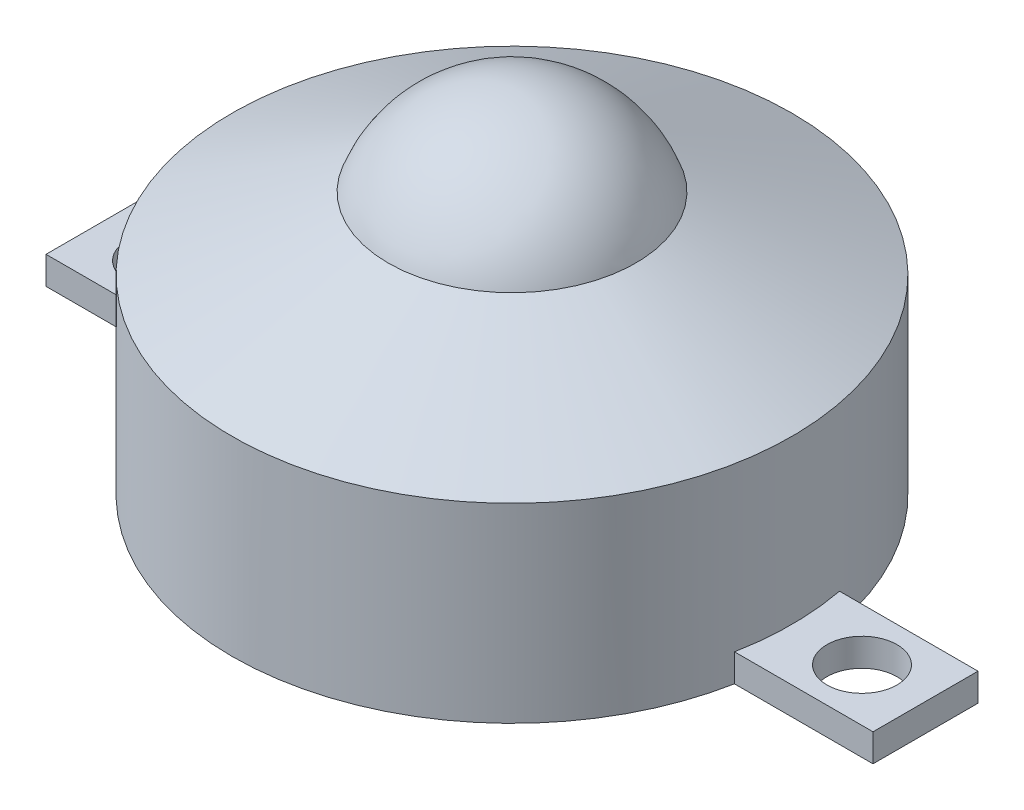
ISO-10303-21;
HEADER;
FILE_DESCRIPTION(('STEP AP214'),'2;1');
FILE_NAME('part.step','',(''),(''),'','','');
FILE_SCHEMA(('AUTOMOTIVE_DESIGN { 1 0 10303 214 1 1 1 1 }'));
ENDSEC;
DATA;
#1=APPLICATION_CONTEXT('core data for automotive mechanical design processes');
#2=APPLICATION_PROTOCOL_DEFINITION('international standard','automotive_design',2000,#1);
#3=PRODUCT_CONTEXT('',#1,'mechanical');
#4=PRODUCT('Part','Part','',(#3));
#5=PRODUCT_RELATED_PRODUCT_CATEGORY('part','',(#4));
#6=PRODUCT_DEFINITION_FORMATION('','',#4);
#7=PRODUCT_DEFINITION_CONTEXT('part definition',#1,'design');
#8=PRODUCT_DEFINITION('design','',#6,#7);
#9=PRODUCT_DEFINITION_SHAPE('','',#8);
#10=(LENGTH_UNIT() NAMED_UNIT(*) SI_UNIT(.MILLI.,.METRE.));
#11=(NAMED_UNIT(*) PLANE_ANGLE_UNIT() SI_UNIT($,.RADIAN.));
#12=(NAMED_UNIT(*) SI_UNIT($,.STERADIAN.) SOLID_ANGLE_UNIT());
#13=UNCERTAINTY_MEASURE_WITH_UNIT(LENGTH_MEASURE(1.E-05),#10,'distance_accuracy_value','');
#14=(GEOMETRIC_REPRESENTATION_CONTEXT(3) GLOBAL_UNCERTAINTY_ASSIGNED_CONTEXT((#13)) GLOBAL_UNIT_ASSIGNED_CONTEXT((#10,
#11,#12)) REPRESENTATION_CONTEXT('',''));
#15=CARTESIAN_POINT('',(0.,0.,0.));
#16=DIRECTION('',(0.,0.,1.));
#17=DIRECTION('',(1.,0.,0.));
#18=AXIS2_PLACEMENT_3D('',#15,#16,#17);
#19=CARTESIAN_POINT('',(0.,12.5014689607191,2.90235366842348E-05));
#20=DIRECTION('',(-1.,0.,0.));
#21=DIRECTION('',(0.,0.,-1.));
#22=AXIS2_PLACEMENT_3D('',#19,#20,#21);
#23=CIRCLE('',#22,7.49853103933704);
#24=TRIMMED_CURVE('',#23,(PARAMETER_VALUE(-1.57079245623191)),
(PARAMETER_VALUE(1.57079245623191)),.T.,.PARAMETER.);
#25=CARTESIAN_POINT('',(0.,12.5014689607191,0.));
#26=DIRECTION('',(0.,-1.,0.));
#27=AXIS1_PLACEMENT('',#25,#26);
#28=SURFACE_OF_REVOLUTION('',#24,#27);
#29=CARTESIAN_POINT('',(0.,15.,0.));
#30=DIRECTION('',(0.,-1.,0.));
#31=DIRECTION('',(0.,0.,-1.));
#32=AXIS2_PLACEMENT_3D('',#29,#30,#31);
#33=CIRCLE('',#32,7.07);
#34=CARTESIAN_POINT('',(0.,15.,-7.07));
#35=VERTEX_POINT('',#34);
#36=EDGE_CURVE('E157',#35,#35,#33,.T.);
#37=ORIENTED_EDGE('',*,*,#36,.F.);
#38=EDGE_LOOP('',(#37));
#39=FACE_BOUND('',#38,.T.);
#40=CARTESIAN_POINT('',(0.,20.,0.));
#41=VERTEX_POINT('',#40);
#42=VERTEX_LOOP('',#41);
#43=FACE_BOUND('',#42,.T.);
#44=ADVANCED_FACE('F40',(#39,#43),#28,.T.);
#45=CARTESIAN_POINT('',(0.,0.,0.));
#46=DIRECTION('',(0.,-1.,0.));
#47=DIRECTION('',(0.,0.,-1.));
#48=AXIS2_PLACEMENT_3D('',#45,#46,#47);
#49=PLANE('',#48);
#50=CARTESIAN_POINT('',(0.,0.,0.));
#51=DIRECTION('',(0.,-1.,0.));
#52=DIRECTION('',(0.,0.,-1.));
#53=AXIS2_PLACEMENT_3D('',#50,#51,#52);
#54=CIRCLE('',#53,16.);
#55=CARTESIAN_POINT('',(-15.7162336455017,0.,-3.));
#56=VERTEX_POINT('',#55);
#57=CARTESIAN_POINT('',(15.7162336455017,0.,-3.));
#58=VERTEX_POINT('',#57);
#59=EDGE_CURVE('E176',#56,#58,#54,.T.);
#60=ORIENTED_EDGE('',*,*,#59,.T.);
#61=DIRECTION('',(1.,0.,0.));
#62=VECTOR('',#61,1.);
#63=CARTESIAN_POINT('',(23.6308002751179,0.,-3.));
#64=LINE('',#63,#62);
#65=CARTESIAN_POINT('',(23.6308002751179,0.,-3.));
#66=VERTEX_POINT('',#65);
#67=EDGE_CURVE('E120',#58,#66,#64,.T.);
#68=ORIENTED_EDGE('',*,*,#67,.T.);
#69=DIRECTION('',(0.,0.,1.));
#70=VECTOR('',#69,1.);
#71=CARTESIAN_POINT('',(23.6308002751179,0.,0.));
#72=LINE('',#71,#70);
#73=CARTESIAN_POINT('',(23.6308002751179,0.,3.));
#74=VERTEX_POINT('',#73);
#75=EDGE_CURVE('E144',#66,#74,#72,.T.);
#76=ORIENTED_EDGE('',*,*,#75,.T.);
#77=DIRECTION('',(-1.,0.,0.));
#78=VECTOR('',#77,1.);
#79=CARTESIAN_POINT('',(23.6308002751179,0.,3.));
#80=LINE('',#79,#78);
#81=CARTESIAN_POINT('',(15.7162336455017,0.,3.));
#82=VERTEX_POINT('',#81);
#83=EDGE_CURVE('E61',#74,#82,#80,.T.);
#84=ORIENTED_EDGE('',*,*,#83,.T.);
#85=CARTESIAN_POINT('',(-15.7162336455017,0.,2.99999999999999));
#86=VERTEX_POINT('',#85);
#87=EDGE_CURVE('E177',#82,#86,#54,.T.);
#88=ORIENTED_EDGE('',*,*,#87,.T.);
#89=DIRECTION('',(-1.,0.,0.));
#90=VECTOR('',#89,1.);
#91=CARTESIAN_POINT('',(-23.6308002751179,0.,3.));
#92=LINE('',#91,#90);
#93=CARTESIAN_POINT('',(-23.6308002751179,0.,3.));
#94=VERTEX_POINT('',#93);
#95=EDGE_CURVE('E148',#86,#94,#92,.T.);
#96=ORIENTED_EDGE('',*,*,#95,.T.);
#97=DIRECTION('',(0.,0.,-1.));
#98=VECTOR('',#97,1.);
#99=CARTESIAN_POINT('',(-23.6308002751179,0.,0.));
#100=LINE('',#99,#98);
#101=CARTESIAN_POINT('',(-23.6308002751179,0.,-3.));
#102=VERTEX_POINT('',#101);
#103=EDGE_CURVE('E151',#94,#102,#100,.T.);
#104=ORIENTED_EDGE('',*,*,#103,.T.);
#105=DIRECTION('',(1.,0.,0.));
#106=VECTOR('',#105,1.);
#107=CARTESIAN_POINT('',(-23.6308002751179,0.,-3.));
#108=LINE('',#107,#106);
#109=EDGE_CURVE('E54',#102,#56,#108,.T.);
#110=ORIENTED_EDGE('',*,*,#109,.T.);
#111=EDGE_LOOP('',(#60,#68,#76,#84,#88,#96,#104,#110));
#112=FACE_BOUND('',#111,.T.);
#113=CARTESIAN_POINT('',(20.,0.,0.));
#114=DIRECTION('',(0.,-1.,0.));
#115=DIRECTION('',(0.,0.,-1.));
#116=AXIS2_PLACEMENT_3D('',#113,#114,#115);
#117=CIRCLE('',#116,2.);
#118=CARTESIAN_POINT('',(20.,0.,-2.));
#119=VERTEX_POINT('',#118);
#120=EDGE_CURVE('E203',#119,#119,#117,.T.);
#121=ORIENTED_EDGE('',*,*,#120,.F.);
#122=EDGE_LOOP('',(#121));
#123=FACE_BOUND('',#122,.T.);
#124=CARTESIAN_POINT('',(-20.,0.,0.));
#125=DIRECTION('',(0.,-1.,0.));
#126=DIRECTION('',(0.,0.,-1.));
#127=AXIS2_PLACEMENT_3D('',#124,#125,#126);
#128=CIRCLE('',#127,2.);
#129=CARTESIAN_POINT('',(-20.,0.,-2.));
#130=VERTEX_POINT('',#129);
#131=EDGE_CURVE('E206',#130,#130,#128,.T.);
#132=ORIENTED_EDGE('',*,*,#131,.F.);
#133=EDGE_LOOP('',(#132));
#134=FACE_BOUND('',#133,.T.);
#135=ADVANCED_FACE('F197',(#112,#123,#134),#49,.T.);
#136=CARTESIAN_POINT('',(0.,0.,0.));
#137=DIRECTION('',(0.,-1.,0.));
#138=DIRECTION('',(0.,0.,-1.));
#139=AXIS2_PLACEMENT_3D('',#136,#137,#138);
#140=CYLINDRICAL_SURFACE('',#139,16.);
#141=DIRECTION('',(0.,-1.,0.));
#142=VECTOR('',#141,1.);
#143=CARTESIAN_POINT('',(15.7162336455017,1.5875,3.));
#144=LINE('',#143,#142);
#145=CARTESIAN_POINT('',(15.7162336455017,1.5875,3.));
#146=VERTEX_POINT('',#145);
#147=EDGE_CURVE('E126',#146,#82,#144,.T.);
#148=ORIENTED_EDGE('',*,*,#147,.F.);
#149=CARTESIAN_POINT('',(0.,1.5875,0.));
#150=DIRECTION('',(0.,-1.,0.));
#151=DIRECTION('',(0.,0.,-1.));
#152=AXIS2_PLACEMENT_3D('',#149,#150,#151);
#153=CIRCLE('',#152,16.);
#154=CARTESIAN_POINT('',(15.7162336455017,1.5875,-3.));
#155=VERTEX_POINT('',#154);
#156=EDGE_CURVE('E47',#146,#155,#153,.F.);
#157=ORIENTED_EDGE('',*,*,#156,.T.);
#158=DIRECTION('',(0.,-1.,0.));
#159=VECTOR('',#158,1.);
#160=CARTESIAN_POINT('',(15.7162336455017,1.5875,-3.));
#161=LINE('',#160,#159);
#162=EDGE_CURVE('E158',#155,#58,#161,.T.);
#163=ORIENTED_EDGE('',*,*,#162,.T.);
#164=ORIENTED_EDGE('',*,*,#59,.F.);
#165=DIRECTION('',(0.,-1.,0.));
#166=VECTOR('',#165,1.);
#167=CARTESIAN_POINT('',(-15.7162336455017,1.5875,-3.));
#168=LINE('',#167,#166);
#169=CARTESIAN_POINT('',(-15.7162336455017,1.5875,-3.));
#170=VERTEX_POINT('',#169);
#171=EDGE_CURVE('E161',#170,#56,#168,.T.);
#172=ORIENTED_EDGE('',*,*,#171,.F.);
#173=CARTESIAN_POINT('',(-15.7162336455017,1.5875,2.99999999999999));
#174=VERTEX_POINT('',#173);
#175=EDGE_CURVE('E11',#170,#174,#153,.F.);
#176=ORIENTED_EDGE('',*,*,#175,.T.);
#177=DIRECTION('',(0.,-1.,0.));
#178=VECTOR('',#177,1.);
#179=CARTESIAN_POINT('',(-15.7162336455017,1.5875,2.99999999999999));
#180=LINE('',#179,#178);
#181=EDGE_CURVE('E168',#174,#86,#180,.T.);
#182=ORIENTED_EDGE('',*,*,#181,.T.);
#183=ORIENTED_EDGE('',*,*,#87,.F.);
#184=EDGE_LOOP('',(#148,#157,#163,#164,#172,#176,#182,#183));
#185=FACE_BOUND('',#184,.T.);
#186=CARTESIAN_POINT('',(0.,10.8913465572875,0.));
#187=DIRECTION('',(0.,-1.,0.));
#188=DIRECTION('',(0.,0.,-1.));
#189=AXIS2_PLACEMENT_3D('',#186,#187,#188);
#190=CIRCLE('',#189,16.);
#191=CARTESIAN_POINT('',(0.,10.8913465572875,-16.));
#192=VERTEX_POINT('',#191);
#193=EDGE_CURVE('E174',#192,#192,#190,.T.);
#194=ORIENTED_EDGE('',*,*,#193,.T.);
#195=EDGE_LOOP('',(#194));
#196=FACE_BOUND('',#195,.T.);
#197=ADVANCED_FACE('F181',(#185,#196),#140,.T.);
#198=CARTESIAN_POINT('',(0.,10.8913465572875,0.));
#199=DIRECTION('',(0.,-1.,0.));
#200=DIRECTION('',(0.,0.,-1.));
#201=AXIS2_PLACEMENT_3D('',#198,#199,#200);
#202=CONICAL_SURFACE('',#201,16.,1.13957870952877);
#203=ORIENTED_EDGE('',*,*,#36,.T.);
#204=EDGE_LOOP('',(#203));
#205=FACE_BOUND('',#204,.T.);
#206=ORIENTED_EDGE('',*,*,#193,.F.);
#207=EDGE_LOOP('',(#206));
#208=FACE_BOUND('',#207,.T.);
#209=ADVANCED_FACE('F224',(#205,#208),#202,.T.);
#210=CARTESIAN_POINT('',(23.6308002751179,1.5875,0.));
#211=DIRECTION('',(1.,0.,0.));
#212=DIRECTION('',(0.,0.,-1.));
#213=AXIS2_PLACEMENT_3D('',#210,#211,#212);
#214=PLANE('',#213);
#215=ORIENTED_EDGE('',*,*,#75,.F.);
#216=DIRECTION('',(0.,-1.,0.));
#217=VECTOR('',#216,1.);
#218=CARTESIAN_POINT('',(23.6308002751179,1.5875,-3.));
#219=LINE('',#218,#217);
#220=CARTESIAN_POINT('',(23.6308002751179,1.5875,-3.));
#221=VERTEX_POINT('',#220);
#222=EDGE_CURVE('E114',#221,#66,#219,.T.);
#223=ORIENTED_EDGE('',*,*,#222,.F.);
#224=DIRECTION('',(0.,0.,1.));
#225=VECTOR('',#224,1.);
#226=CARTESIAN_POINT('',(23.6308002751179,1.5875,0.));
#227=LINE('',#226,#225);
#228=CARTESIAN_POINT('',(23.6308002751179,1.5875,3.));
#229=VERTEX_POINT('',#228);
#230=EDGE_CURVE('E109',#221,#229,#227,.T.);
#231=ORIENTED_EDGE('',*,*,#230,.T.);
#232=DIRECTION('',(0.,-1.,0.));
#233=VECTOR('',#232,1.);
#234=CARTESIAN_POINT('',(23.6308002751179,1.5875,3.));
#235=LINE('',#234,#233);
#236=EDGE_CURVE('E112',#229,#74,#235,.T.);
#237=ORIENTED_EDGE('',*,*,#236,.T.);
#238=EDGE_LOOP('',(#215,#223,#231,#237));
#239=FACE_BOUND('',#238,.T.);
#240=ADVANCED_FACE('F111',(#239),#214,.T.);
#241=CARTESIAN_POINT('',(20.,1.5875,0.));
#242=DIRECTION('',(0.,-1.,0.));
#243=DIRECTION('',(0.,0.,-1.));
#244=AXIS2_PLACEMENT_3D('',#241,#242,#243);
#245=CYLINDRICAL_SURFACE('',#244,2.);
#246=CARTESIAN_POINT('',(20.,1.5875,0.));
#247=DIRECTION('',(0.,-1.,0.));
#248=DIRECTION('',(0.,0.,-1.));
#249=AXIS2_PLACEMENT_3D('',#246,#247,#248);
#250=CIRCLE('',#249,2.);
#251=CARTESIAN_POINT('',(20.,1.5875,-2.));
#252=VERTEX_POINT('',#251);
#253=EDGE_CURVE('E208',#252,#252,#250,.T.);
#254=ORIENTED_EDGE('',*,*,#253,.F.);
#255=EDGE_LOOP('',(#254));
#256=FACE_BOUND('',#255,.T.);
#257=ORIENTED_EDGE('',*,*,#120,.T.);
#258=EDGE_LOOP('',(#257));
#259=FACE_BOUND('',#258,.T.);
#260=ADVANCED_FACE('F215',(#256,#259),#245,.F.);
#261=CARTESIAN_POINT('',(0.,1.5875,0.));
#262=DIRECTION('',(0.,-1.,0.));
#263=DIRECTION('',(0.,0.,-1.));
#264=AXIS2_PLACEMENT_3D('',#261,#262,#263);
#265=PLANE('',#264);
#266=ORIENTED_EDGE('',*,*,#156,.F.);
#267=DIRECTION('',(-1.,0.,0.));
#268=VECTOR('',#267,1.);
#269=CARTESIAN_POINT('',(23.6308002751179,1.5875,3.));
#270=LINE('',#269,#268);
#271=EDGE_CURVE('E119',#229,#146,#270,.T.);
#272=ORIENTED_EDGE('',*,*,#271,.F.);
#273=ORIENTED_EDGE('',*,*,#230,.F.);
#274=DIRECTION('',(1.,0.,0.));
#275=VECTOR('',#274,1.);
#276=CARTESIAN_POINT('',(23.6308002751179,1.5875,-3.));
#277=LINE('',#276,#275);
#278=EDGE_CURVE('E127',#155,#221,#277,.T.);
#279=ORIENTED_EDGE('',*,*,#278,.F.);
#280=EDGE_LOOP('',(#266,#272,#273,#279));
#281=FACE_BOUND('',#280,.T.);
#282=ORIENTED_EDGE('',*,*,#253,.T.);
#283=EDGE_LOOP('',(#282));
#284=FACE_BOUND('',#283,.T.);
#285=ADVANCED_FACE('F129',(#281,#284),#265,.F.);
#286=CARTESIAN_POINT('',(23.6308002751179,1.5875,3.));
#287=DIRECTION('',(0.,0.,1.));
#288=DIRECTION('',(1.,0.,0.));
#289=AXIS2_PLACEMENT_3D('',#286,#287,#288);
#290=PLANE('',#289);
#291=ORIENTED_EDGE('',*,*,#83,.F.);
#292=ORIENTED_EDGE('',*,*,#236,.F.);
#293=ORIENTED_EDGE('',*,*,#271,.T.);
#294=ORIENTED_EDGE('',*,*,#147,.T.);
#295=EDGE_LOOP('',(#291,#292,#293,#294));
#296=FACE_BOUND('',#295,.T.);
#297=ADVANCED_FACE('F124',(#296),#290,.T.);
#298=CARTESIAN_POINT('',(23.6308002751179,1.5875,-3.));
#299=DIRECTION('',(0.,0.,-1.));
#300=DIRECTION('',(-1.,0.,0.));
#301=AXIS2_PLACEMENT_3D('',#298,#299,#300);
#302=PLANE('',#301);
#303=ORIENTED_EDGE('',*,*,#67,.F.);
#304=ORIENTED_EDGE('',*,*,#162,.F.);
#305=ORIENTED_EDGE('',*,*,#278,.T.);
#306=ORIENTED_EDGE('',*,*,#222,.T.);
#307=EDGE_LOOP('',(#303,#304,#305,#306));
#308=FACE_BOUND('',#307,.T.);
#309=ADVANCED_FACE('F246',(#308),#302,.T.);
#310=ORIENTED_EDGE('',*,*,#175,.F.);
#311=DIRECTION('',(1.,0.,0.));
#312=VECTOR('',#311,1.);
#313=CARTESIAN_POINT('',(-23.6308002751179,1.5875,-3.));
#314=LINE('',#313,#312);
#315=CARTESIAN_POINT('',(-23.6308002751179,1.5875,-3.));
#316=VERTEX_POINT('',#315);
#317=EDGE_CURVE('E140',#316,#170,#314,.T.);
#318=ORIENTED_EDGE('',*,*,#317,.F.);
#319=DIRECTION('',(0.,0.,-1.));
#320=VECTOR('',#319,1.);
#321=CARTESIAN_POINT('',(-23.6308002751179,1.5875,0.));
#322=LINE('',#321,#320);
#323=CARTESIAN_POINT('',(-23.6308002751179,1.5875,3.));
#324=VERTEX_POINT('',#323);
#325=EDGE_CURVE('E135',#324,#316,#322,.T.);
#326=ORIENTED_EDGE('',*,*,#325,.F.);
#327=DIRECTION('',(-1.,0.,0.));
#328=VECTOR('',#327,1.);
#329=CARTESIAN_POINT('',(-23.6308002751179,1.5875,3.));
#330=LINE('',#329,#328);
#331=EDGE_CURVE('E132',#174,#324,#330,.T.);
#332=ORIENTED_EDGE('',*,*,#331,.F.);
#333=EDGE_LOOP('',(#310,#318,#326,#332));
#334=FACE_BOUND('',#333,.T.);
#335=CARTESIAN_POINT('',(-20.,1.5875,0.));
#336=DIRECTION('',(0.,-1.,0.));
#337=DIRECTION('',(0.,0.,-1.));
#338=AXIS2_PLACEMENT_3D('',#335,#336,#337);
#339=CIRCLE('',#338,2.);
#340=CARTESIAN_POINT('',(-20.,1.5875,-2.));
#341=VERTEX_POINT('',#340);
#342=EDGE_CURVE('E146',#341,#341,#339,.T.);
#343=ORIENTED_EDGE('',*,*,#342,.T.);
#344=EDGE_LOOP('',(#343));
#345=FACE_BOUND('',#344,.T.);
#346=ADVANCED_FACE('F189',(#334,#345),#265,.F.);
#347=CARTESIAN_POINT('',(-23.6308002751179,1.5875,-3.));
#348=DIRECTION('',(0.,0.,-1.));
#349=DIRECTION('',(-1.,0.,0.));
#350=AXIS2_PLACEMENT_3D('',#347,#348,#349);
#351=PLANE('',#350);
#352=ORIENTED_EDGE('',*,*,#109,.F.);
#353=DIRECTION('',(0.,-1.,0.));
#354=VECTOR('',#353,1.);
#355=CARTESIAN_POINT('',(-23.6308002751179,1.5875,-3.));
#356=LINE('',#355,#354);
#357=EDGE_CURVE('E163',#316,#102,#356,.T.);
#358=ORIENTED_EDGE('',*,*,#357,.F.);
#359=ORIENTED_EDGE('',*,*,#317,.T.);
#360=ORIENTED_EDGE('',*,*,#171,.T.);
#361=EDGE_LOOP('',(#352,#358,#359,#360));
#362=FACE_BOUND('',#361,.T.);
#363=ADVANCED_FACE('F196',(#362),#351,.T.);
#364=CARTESIAN_POINT('',(-23.6308002751179,1.5875,0.));
#365=DIRECTION('',(-1.,0.,0.));
#366=DIRECTION('',(0.,0.,1.));
#367=AXIS2_PLACEMENT_3D('',#364,#365,#366);
#368=PLANE('',#367);
#369=ORIENTED_EDGE('',*,*,#103,.F.);
#370=DIRECTION('',(0.,-1.,0.));
#371=VECTOR('',#370,1.);
#372=CARTESIAN_POINT('',(-23.6308002751179,1.5875,3.));
#373=LINE('',#372,#371);
#374=EDGE_CURVE('E165',#324,#94,#373,.T.);
#375=ORIENTED_EDGE('',*,*,#374,.F.);
#376=ORIENTED_EDGE('',*,*,#325,.T.);
#377=ORIENTED_EDGE('',*,*,#357,.T.);
#378=EDGE_LOOP('',(#369,#375,#376,#377));
#379=FACE_BOUND('',#378,.T.);
#380=ADVANCED_FACE('F194',(#379),#368,.T.);
#381=CARTESIAN_POINT('',(-23.6308002751179,1.5875,3.));
#382=DIRECTION('',(0.,0.,1.));
#383=DIRECTION('',(1.,0.,0.));
#384=AXIS2_PLACEMENT_3D('',#381,#382,#383);
#385=PLANE('',#384);
#386=ORIENTED_EDGE('',*,*,#95,.F.);
#387=ORIENTED_EDGE('',*,*,#181,.F.);
#388=ORIENTED_EDGE('',*,*,#331,.T.);
#389=ORIENTED_EDGE('',*,*,#374,.T.);
#390=EDGE_LOOP('',(#386,#387,#388,#389));
#391=FACE_BOUND('',#390,.T.);
#392=ADVANCED_FACE('F186',(#391),#385,.T.);
#393=CARTESIAN_POINT('',(-20.,1.5875,0.));
#394=DIRECTION('',(0.,-1.,0.));
#395=DIRECTION('',(0.,0.,-1.));
#396=AXIS2_PLACEMENT_3D('',#393,#394,#395);
#397=CYLINDRICAL_SURFACE('',#396,2.);
#398=ORIENTED_EDGE('',*,*,#342,.F.);
#399=EDGE_LOOP('',(#398));
#400=FACE_BOUND('',#399,.T.);
#401=ORIENTED_EDGE('',*,*,#131,.T.);
#402=EDGE_LOOP('',(#401));
#403=FACE_BOUND('',#402,.T.);
#404=ADVANCED_FACE('F249',(#400,#403),#397,.F.);
#405=CLOSED_SHELL('',(#44,#135,#197,#209,#240,#260,#285,#297,#309,#346,#363,#380,#392,#404));
#406=MANIFOLD_SOLID_BREP('B2',#405);
#407=ADVANCED_BREP_SHAPE_REPRESENTATION('',(#18,#406),#14);
#408=SHAPE_DEFINITION_REPRESENTATION(#9,#407);
ENDSEC;
END-ISO-10303-21;
